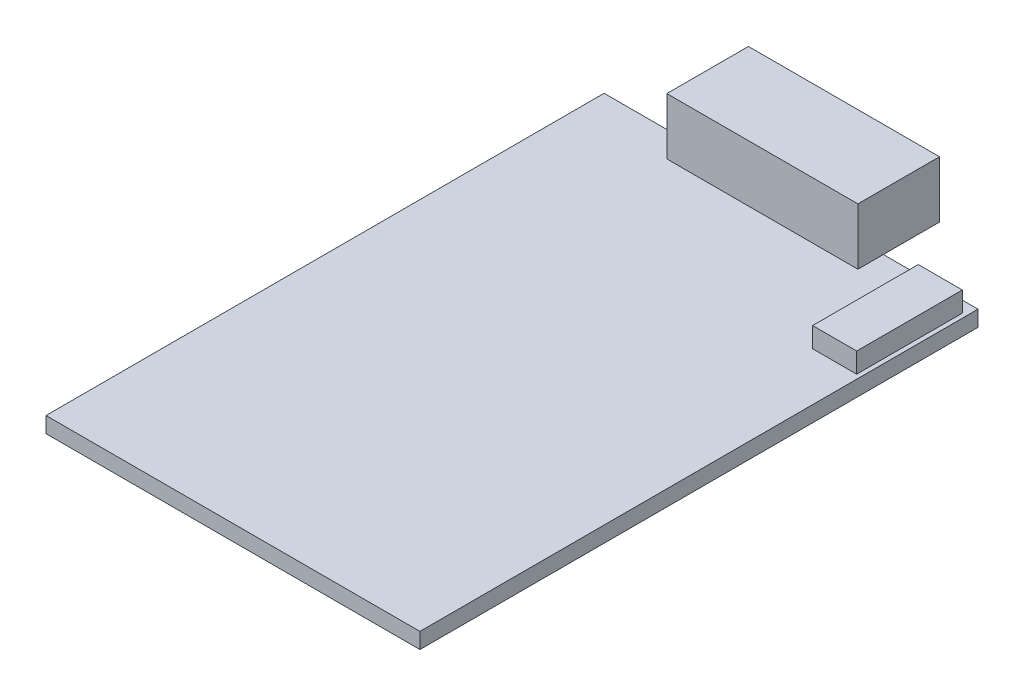
ISO-10303-21;
HEADER;
FILE_DESCRIPTION(('STEP AP214'),'2;1');
FILE_NAME('part.step','',(''),(''),'','','');
FILE_SCHEMA(('AUTOMOTIVE_DESIGN { 1 0 10303 214 1 1 1 1 }'));
ENDSEC;
DATA;
#1=APPLICATION_CONTEXT('core data for automotive mechanical design processes');
#2=APPLICATION_PROTOCOL_DEFINITION('international standard','automotive_design',2000,#1);
#3=PRODUCT_CONTEXT('',#1,'mechanical');
#4=PRODUCT('Part','Part','',(#3));
#5=PRODUCT_RELATED_PRODUCT_CATEGORY('part','',(#4));
#6=PRODUCT_DEFINITION_FORMATION('','',#4);
#7=PRODUCT_DEFINITION_CONTEXT('part definition',#1,'design');
#8=PRODUCT_DEFINITION('design','',#6,#7);
#9=PRODUCT_DEFINITION_SHAPE('','',#8);
#10=(LENGTH_UNIT() NAMED_UNIT(*) SI_UNIT(.MILLI.,.METRE.));
#11=(NAMED_UNIT(*) PLANE_ANGLE_UNIT() SI_UNIT($,.RADIAN.));
#12=(NAMED_UNIT(*) SI_UNIT($,.STERADIAN.) SOLID_ANGLE_UNIT());
#13=UNCERTAINTY_MEASURE_WITH_UNIT(LENGTH_MEASURE(1.E-05),#10,'distance_accuracy_value','');
#14=(GEOMETRIC_REPRESENTATION_CONTEXT(3) GLOBAL_UNCERTAINTY_ASSIGNED_CONTEXT((#13)) GLOBAL_UNIT_ASSIGNED_CONTEXT((#10,
#11,#12)) REPRESENTATION_CONTEXT('',''));
#15=CARTESIAN_POINT('',(0.,0.,0.));
#16=DIRECTION('',(0.,0.,1.));
#17=DIRECTION('',(1.,0.,0.));
#18=AXIS2_PLACEMENT_3D('',#15,#16,#17);
#19=CARTESIAN_POINT('',(0.,1.67,0.));
#20=DIRECTION('',(0.,-1.,0.));
#21=DIRECTION('',(0.,0.,-1.));
#22=AXIS2_PLACEMENT_3D('',#19,#20,#21);
#23=PLANE('',#22);
#24=DIRECTION('',(0.,0.,-1.));
#25=VECTOR('',#24,1.);
#26=CARTESIAN_POINT('',(29.6,1.67,0.));
#27=LINE('',#26,#25);
#28=CARTESIAN_POINT('',(29.6,1.67,-56.45));
#29=VERTEX_POINT('',#28);
#30=CARTESIAN_POINT('',(29.6,1.67,-59.15));
#31=VERTEX_POINT('',#30);
#32=EDGE_CURVE('E166',#29,#31,#27,.T.);
#33=ORIENTED_EDGE('',*,*,#32,.F.);
#34=DIRECTION('',(1.,0.,0.));
#35=VECTOR('',#34,1.);
#36=CARTESIAN_POINT('',(0.,1.67,-56.45));
#37=LINE('',#36,#35);
#38=CARTESIAN_POINT('',(9.34999999999998,1.67,-56.45));
#39=VERTEX_POINT('',#38);
#40=EDGE_CURVE('E176',#39,#29,#37,.T.);
#41=ORIENTED_EDGE('',*,*,#40,.F.);
#42=DIRECTION('',(0.,0.,1.));
#43=VECTOR('',#42,1.);
#44=CARTESIAN_POINT('',(9.35,1.67,0.));
#45=LINE('',#44,#43);
#46=CARTESIAN_POINT('',(9.34999999999998,1.67,-59.15));
#47=VERTEX_POINT('',#46);
#48=EDGE_CURVE('E11',#47,#39,#45,.T.);
#49=ORIENTED_EDGE('',*,*,#48,.F.);
#50=DIRECTION('',(-1.,0.,0.));
#51=VECTOR('',#50,1.);
#52=CARTESIAN_POINT('',(0.,1.67,-59.15));
#53=LINE('',#52,#51);
#54=CARTESIAN_POINT('',(0.,1.67,-59.15));
#55=VERTEX_POINT('',#54);
#56=EDGE_CURVE('E202',#47,#55,#53,.T.);
#57=ORIENTED_EDGE('',*,*,#56,.T.);
#58=DIRECTION('',(0.,0.,1.));
#59=VECTOR('',#58,1.);
#60=CARTESIAN_POINT('',(0.,1.67,0.));
#61=LINE('',#60,#59);
#62=CARTESIAN_POINT('',(0.,1.67,0.));
#63=VERTEX_POINT('',#62);
#64=EDGE_CURVE('E194',#55,#63,#61,.T.);
#65=ORIENTED_EDGE('',*,*,#64,.T.);
#66=DIRECTION('',(1.,0.,0.));
#67=VECTOR('',#66,1.);
#68=CARTESIAN_POINT('',(0.,1.67,0.));
#69=LINE('',#68,#67);
#70=CARTESIAN_POINT('',(39.63,1.67,0.));
#71=VERTEX_POINT('',#70);
#72=EDGE_CURVE('E197',#63,#71,#69,.T.);
#73=ORIENTED_EDGE('',*,*,#72,.T.);
#74=DIRECTION('',(0.,0.,-1.));
#75=VECTOR('',#74,1.);
#76=CARTESIAN_POINT('',(39.63,1.67,0.));
#77=LINE('',#76,#75);
#78=CARTESIAN_POINT('',(39.63,1.67,-59.15));
#79=VERTEX_POINT('',#78);
#80=EDGE_CURVE('E200',#71,#79,#77,.T.);
#81=ORIENTED_EDGE('',*,*,#80,.T.);
#82=EDGE_CURVE('E203',#79,#31,#53,.T.);
#83=ORIENTED_EDGE('',*,*,#82,.T.);
#84=EDGE_LOOP('',(#33,#41,#49,#57,#65,#73,#81,#83));
#85=FACE_BOUND('',#84,.T.);
#86=DIRECTION('',(0.,0.,-1.));
#87=VECTOR('',#86,1.);
#88=CARTESIAN_POINT('',(39.17,1.67,0.));
#89=LINE('',#88,#87);
#90=CARTESIAN_POINT('',(39.17,1.67,-46.75));
#91=VERTEX_POINT('',#90);
#92=CARTESIAN_POINT('',(39.17,1.67,-57.95));
#93=VERTEX_POINT('',#92);
#94=EDGE_CURVE('E149',#91,#93,#89,.T.);
#95=ORIENTED_EDGE('',*,*,#94,.F.);
#96=DIRECTION('',(1.,0.,0.));
#97=VECTOR('',#96,1.);
#98=CARTESIAN_POINT('',(0.,1.67,-46.75));
#99=LINE('',#98,#97);
#100=CARTESIAN_POINT('',(34.5,1.67,-46.75));
#101=VERTEX_POINT('',#100);
#102=EDGE_CURVE('E150',#101,#91,#99,.T.);
#103=ORIENTED_EDGE('',*,*,#102,.F.);
#104=DIRECTION('',(0.,0.,1.));
#105=VECTOR('',#104,1.);
#106=CARTESIAN_POINT('',(34.5,1.67,0.));
#107=LINE('',#106,#105);
#108=CARTESIAN_POINT('',(34.5,1.67,-57.95));
#109=VERTEX_POINT('',#108);
#110=EDGE_CURVE('E55',#109,#101,#107,.T.);
#111=ORIENTED_EDGE('',*,*,#110,.F.);
#112=DIRECTION('',(-1.,0.,0.));
#113=VECTOR('',#112,1.);
#114=CARTESIAN_POINT('',(0.,1.67,-57.95));
#115=LINE('',#114,#113);
#116=EDGE_CURVE('E50',#93,#109,#115,.T.);
#117=ORIENTED_EDGE('',*,*,#116,.F.);
#118=EDGE_LOOP('',(#95,#103,#111,#117));
#119=FACE_BOUND('',#118,.T.);
#120=ADVANCED_FACE('F33',(#85,#119),#23,.F.);
#121=CARTESIAN_POINT('',(0.,1.67,0.));
#122=DIRECTION('',(1.,0.,0.));
#123=DIRECTION('',(0.,0.,-1.));
#124=AXIS2_PLACEMENT_3D('',#121,#122,#123);
#125=PLANE('',#124);
#126=DIRECTION('',(0.,0.,1.));
#127=VECTOR('',#126,1.);
#128=CARTESIAN_POINT('',(0.,0.,0.));
#129=LINE('',#128,#127);
#130=CARTESIAN_POINT('',(0.,0.,-59.15));
#131=VERTEX_POINT('',#130);
#132=CARTESIAN_POINT('',(0.,0.,0.));
#133=VERTEX_POINT('',#132);
#134=EDGE_CURVE('E193',#131,#133,#129,.T.);
#135=ORIENTED_EDGE('',*,*,#134,.T.);
#136=DIRECTION('',(0.,-1.,0.));
#137=VECTOR('',#136,1.);
#138=CARTESIAN_POINT('',(0.,1.67,0.));
#139=LINE('',#138,#137);
#140=EDGE_CURVE('E37',#63,#133,#139,.T.);
#141=ORIENTED_EDGE('',*,*,#140,.F.);
#142=ORIENTED_EDGE('',*,*,#64,.F.);
#143=DIRECTION('',(0.,-1.,0.));
#144=VECTOR('',#143,1.);
#145=CARTESIAN_POINT('',(0.,1.67,-59.15));
#146=LINE('',#145,#144);
#147=EDGE_CURVE('E206',#55,#131,#146,.T.);
#148=ORIENTED_EDGE('',*,*,#147,.T.);
#149=EDGE_LOOP('',(#135,#141,#142,#148));
#150=FACE_BOUND('',#149,.T.);
#151=ADVANCED_FACE('F35',(#150),#125,.F.);
#152=CARTESIAN_POINT('',(0.,1.67,0.));
#153=DIRECTION('',(0.,0.,-1.));
#154=DIRECTION('',(-1.,0.,0.));
#155=AXIS2_PLACEMENT_3D('',#152,#153,#154);
#156=PLANE('',#155);
#157=DIRECTION('',(1.,0.,0.));
#158=VECTOR('',#157,1.);
#159=CARTESIAN_POINT('',(0.,0.,0.));
#160=LINE('',#159,#158);
#161=CARTESIAN_POINT('',(39.63,0.,0.));
#162=VERTEX_POINT('',#161);
#163=EDGE_CURVE('E210',#133,#162,#160,.T.);
#164=ORIENTED_EDGE('',*,*,#163,.T.);
#165=DIRECTION('',(0.,-1.,0.));
#166=VECTOR('',#165,1.);
#167=CARTESIAN_POINT('',(39.63,1.67,0.));
#168=LINE('',#167,#166);
#169=EDGE_CURVE('E219',#71,#162,#168,.T.);
#170=ORIENTED_EDGE('',*,*,#169,.F.);
#171=ORIENTED_EDGE('',*,*,#72,.F.);
#172=ORIENTED_EDGE('',*,*,#140,.T.);
#173=EDGE_LOOP('',(#164,#170,#171,#172));
#174=FACE_BOUND('',#173,.T.);
#175=ADVANCED_FACE('F228',(#174),#156,.F.);
#176=CARTESIAN_POINT('',(39.63,1.67,0.));
#177=DIRECTION('',(-1.,0.,0.));
#178=DIRECTION('',(0.,0.,1.));
#179=AXIS2_PLACEMENT_3D('',#176,#177,#178);
#180=PLANE('',#179);
#181=DIRECTION('',(0.,0.,-1.));
#182=VECTOR('',#181,1.);
#183=CARTESIAN_POINT('',(39.63,0.,0.));
#184=LINE('',#183,#182);
#185=CARTESIAN_POINT('',(39.63,0.,-59.15));
#186=VERTEX_POINT('',#185);
#187=EDGE_CURVE('E212',#162,#186,#184,.T.);
#188=ORIENTED_EDGE('',*,*,#187,.T.);
#189=DIRECTION('',(0.,-1.,0.));
#190=VECTOR('',#189,1.);
#191=CARTESIAN_POINT('',(39.63,1.67,-59.15));
#192=LINE('',#191,#190);
#193=EDGE_CURVE('E217',#79,#186,#192,.T.);
#194=ORIENTED_EDGE('',*,*,#193,.F.);
#195=ORIENTED_EDGE('',*,*,#80,.F.);
#196=ORIENTED_EDGE('',*,*,#169,.T.);
#197=EDGE_LOOP('',(#188,#194,#195,#196));
#198=FACE_BOUND('',#197,.T.);
#199=ADVANCED_FACE('F237',(#198),#180,.F.);
#200=CARTESIAN_POINT('',(0.,1.67,-59.15));
#201=DIRECTION('',(0.,0.,1.));
#202=DIRECTION('',(1.,0.,0.));
#203=AXIS2_PLACEMENT_3D('',#200,#201,#202);
#204=PLANE('',#203);
#205=DIRECTION('',(-1.,0.,0.));
#206=VECTOR('',#205,1.);
#207=CARTESIAN_POINT('',(0.,0.,-59.15));
#208=LINE('',#207,#206);
#209=EDGE_CURVE('E198',#186,#131,#208,.T.);
#210=ORIENTED_EDGE('',*,*,#209,.T.);
#211=ORIENTED_EDGE('',*,*,#147,.F.);
#212=ORIENTED_EDGE('',*,*,#56,.F.);
#213=EDGE_CURVE('E207',#31,#47,#53,.T.);
#214=ORIENTED_EDGE('',*,*,#213,.F.);
#215=ORIENTED_EDGE('',*,*,#82,.F.);
#216=ORIENTED_EDGE('',*,*,#193,.T.);
#217=EDGE_LOOP('',(#210,#211,#212,#214,#215,#216));
#218=FACE_BOUND('',#217,.T.);
#219=ADVANCED_FACE('F240',(#218),#204,.F.);
#220=CARTESIAN_POINT('',(0.,0.,0.));
#221=DIRECTION('',(0.,-1.,0.));
#222=DIRECTION('',(0.,0.,-1.));
#223=AXIS2_PLACEMENT_3D('',#220,#221,#222);
#224=PLANE('',#223);
#225=ORIENTED_EDGE('',*,*,#134,.F.);
#226=ORIENTED_EDGE('',*,*,#209,.F.);
#227=ORIENTED_EDGE('',*,*,#187,.F.);
#228=ORIENTED_EDGE('',*,*,#163,.F.);
#229=EDGE_LOOP('',(#225,#226,#227,#228));
#230=FACE_BOUND('',#229,.T.);
#231=ADVANCED_FACE('F235',(#230),#224,.T.);
#232=CARTESIAN_POINT('',(0.,1.67,0.));
#233=DIRECTION('',(0.,1.,0.));
#234=DIRECTION('',(0.,0.,1.));
#235=AXIS2_PLACEMENT_3D('',#232,#233,#234);
#236=PLANE('',#235);
#237=CARTESIAN_POINT('',(29.6,1.67,-65.1));
#238=VERTEX_POINT('',#237);
#239=EDGE_CURVE('E179',#31,#238,#27,.T.);
#240=ORIENTED_EDGE('',*,*,#239,.F.);
#241=ORIENTED_EDGE('',*,*,#213,.T.);
#242=CARTESIAN_POINT('',(9.34999999999998,1.67,-65.1));
#243=VERTEX_POINT('',#242);
#244=EDGE_CURVE('E43',#243,#47,#45,.T.);
#245=ORIENTED_EDGE('',*,*,#244,.F.);
#246=DIRECTION('',(-1.,0.,0.));
#247=VECTOR('',#246,1.);
#248=CARTESIAN_POINT('',(0.,1.67,-65.1));
#249=LINE('',#248,#247);
#250=EDGE_CURVE('E161',#238,#243,#249,.T.);
#251=ORIENTED_EDGE('',*,*,#250,.F.);
#252=EDGE_LOOP('',(#240,#241,#245,#251));
#253=FACE_BOUND('',#252,.T.);
#254=ADVANCED_FACE('F247',(#253),#236,.F.);
#255=CARTESIAN_POINT('',(0.,7.67,-65.1));
#256=DIRECTION('',(0.,0.,1.));
#257=DIRECTION('',(1.,0.,0.));
#258=AXIS2_PLACEMENT_3D('',#255,#256,#257);
#259=PLANE('',#258);
#260=ORIENTED_EDGE('',*,*,#250,.T.);
#261=DIRECTION('',(0.,-1.,0.));
#262=VECTOR('',#261,1.);
#263=CARTESIAN_POINT('',(9.34999999999998,7.67,-65.1));
#264=LINE('',#263,#262);
#265=CARTESIAN_POINT('',(9.34999999999998,7.67,-65.1));
#266=VERTEX_POINT('',#265);
#267=EDGE_CURVE('E190',#266,#243,#264,.T.);
#268=ORIENTED_EDGE('',*,*,#267,.F.);
#269=DIRECTION('',(-1.,0.,0.));
#270=VECTOR('',#269,1.);
#271=CARTESIAN_POINT('',(0.,7.67,-65.1));
#272=LINE('',#271,#270);
#273=CARTESIAN_POINT('',(29.6,7.67,-65.1));
#274=VERTEX_POINT('',#273);
#275=EDGE_CURVE('E162',#274,#266,#272,.T.);
#276=ORIENTED_EDGE('',*,*,#275,.F.);
#277=DIRECTION('',(0.,-1.,0.));
#278=VECTOR('',#277,1.);
#279=CARTESIAN_POINT('',(29.6,7.67,-65.1));
#280=LINE('',#279,#278);
#281=EDGE_CURVE('E172',#274,#238,#280,.T.);
#282=ORIENTED_EDGE('',*,*,#281,.T.);
#283=EDGE_LOOP('',(#260,#268,#276,#282));
#284=FACE_BOUND('',#283,.T.);
#285=ADVANCED_FACE('F262',(#284),#259,.F.);
#286=CARTESIAN_POINT('',(9.35,7.67,0.));
#287=DIRECTION('',(1.,0.,0.));
#288=DIRECTION('',(0.,0.,-1.));
#289=AXIS2_PLACEMENT_3D('',#286,#287,#288);
#290=PLANE('',#289);
#291=ORIENTED_EDGE('',*,*,#244,.T.);
#292=ORIENTED_EDGE('',*,*,#48,.T.);
#293=DIRECTION('',(0.,-1.,0.));
#294=VECTOR('',#293,1.);
#295=CARTESIAN_POINT('',(9.34999999999998,7.67,-56.45));
#296=LINE('',#295,#294);
#297=CARTESIAN_POINT('',(9.34999999999998,7.67,-56.45));
#298=VERTEX_POINT('',#297);
#299=EDGE_CURVE('E187',#298,#39,#296,.T.);
#300=ORIENTED_EDGE('',*,*,#299,.F.);
#301=DIRECTION('',(0.,0.,1.));
#302=VECTOR('',#301,1.);
#303=CARTESIAN_POINT('',(9.35,7.67,0.));
#304=LINE('',#303,#302);
#305=EDGE_CURVE('E165',#266,#298,#304,.T.);
#306=ORIENTED_EDGE('',*,*,#305,.F.);
#307=ORIENTED_EDGE('',*,*,#267,.T.);
#308=EDGE_LOOP('',(#291,#292,#300,#306,#307));
#309=FACE_BOUND('',#308,.T.);
#310=ADVANCED_FACE('F258',(#309),#290,.F.);
#311=CARTESIAN_POINT('',(0.,7.67,-56.45));
#312=DIRECTION('',(0.,0.,-1.));
#313=DIRECTION('',(-1.,0.,0.));
#314=AXIS2_PLACEMENT_3D('',#311,#312,#313);
#315=PLANE('',#314);
#316=ORIENTED_EDGE('',*,*,#40,.T.);
#317=DIRECTION('',(0.,-1.,0.));
#318=VECTOR('',#317,1.);
#319=CARTESIAN_POINT('',(29.6,7.67,-56.45));
#320=LINE('',#319,#318);
#321=CARTESIAN_POINT('',(29.6,7.67,-56.45));
#322=VERTEX_POINT('',#321);
#323=EDGE_CURVE('E184',#322,#29,#320,.T.);
#324=ORIENTED_EDGE('',*,*,#323,.F.);
#325=DIRECTION('',(1.,0.,0.));
#326=VECTOR('',#325,1.);
#327=CARTESIAN_POINT('',(0.,7.67,-56.45));
#328=LINE('',#327,#326);
#329=EDGE_CURVE('E168',#298,#322,#328,.T.);
#330=ORIENTED_EDGE('',*,*,#329,.F.);
#331=ORIENTED_EDGE('',*,*,#299,.T.);
#332=EDGE_LOOP('',(#316,#324,#330,#331));
#333=FACE_BOUND('',#332,.T.);
#334=ADVANCED_FACE('F255',(#333),#315,.F.);
#335=CARTESIAN_POINT('',(29.6,7.67,0.));
#336=DIRECTION('',(-1.,0.,0.));
#337=DIRECTION('',(0.,0.,1.));
#338=AXIS2_PLACEMENT_3D('',#335,#336,#337);
#339=PLANE('',#338);
#340=ORIENTED_EDGE('',*,*,#32,.T.);
#341=ORIENTED_EDGE('',*,*,#239,.T.);
#342=ORIENTED_EDGE('',*,*,#281,.F.);
#343=DIRECTION('',(0.,0.,-1.));
#344=VECTOR('',#343,1.);
#345=CARTESIAN_POINT('',(29.6,7.67,0.));
#346=LINE('',#345,#344);
#347=EDGE_CURVE('E170',#322,#274,#346,.T.);
#348=ORIENTED_EDGE('',*,*,#347,.F.);
#349=ORIENTED_EDGE('',*,*,#323,.T.);
#350=EDGE_LOOP('',(#340,#341,#342,#348,#349));
#351=FACE_BOUND('',#350,.T.);
#352=ADVANCED_FACE('F250',(#351),#339,.F.);
#353=CARTESIAN_POINT('',(0.,7.67,0.));
#354=DIRECTION('',(0.,1.,0.));
#355=DIRECTION('',(0.,0.,1.));
#356=AXIS2_PLACEMENT_3D('',#353,#354,#355);
#357=PLANE('',#356);
#358=ORIENTED_EDGE('',*,*,#275,.T.);
#359=ORIENTED_EDGE('',*,*,#305,.T.);
#360=ORIENTED_EDGE('',*,*,#329,.T.);
#361=ORIENTED_EDGE('',*,*,#347,.T.);
#362=EDGE_LOOP('',(#358,#359,#360,#361));
#363=FACE_BOUND('',#362,.T.);
#364=ADVANCED_FACE('F264',(#363),#357,.T.);
#365=CARTESIAN_POINT('',(39.17,3.8,-57.95));
#366=DIRECTION('',(-1.,0.,0.));
#367=DIRECTION('',(0.,0.,1.));
#368=AXIS2_PLACEMENT_3D('',#365,#366,#367);
#369=PLANE('',#368);
#370=DIRECTION('',(0.,-1.,0.));
#371=VECTOR('',#370,1.);
#372=CARTESIAN_POINT('',(39.17,3.8,-46.75));
#373=LINE('',#372,#371);
#374=CARTESIAN_POINT('',(39.17,3.8,-46.75));
#375=VERTEX_POINT('',#374);
#376=EDGE_CURVE('E385',#375,#91,#373,.T.);
#377=ORIENTED_EDGE('',*,*,#376,.T.);
#378=ORIENTED_EDGE('',*,*,#94,.T.);
#379=DIRECTION('',(0.,-1.,0.));
#380=VECTOR('',#379,1.);
#381=CARTESIAN_POINT('',(39.17,3.8,-57.95));
#382=LINE('',#381,#380);
#383=CARTESIAN_POINT('',(39.17,3.8,-57.95));
#384=VERTEX_POINT('',#383);
#385=EDGE_CURVE('E132',#384,#93,#382,.T.);
#386=ORIENTED_EDGE('',*,*,#385,.F.);
#387=DIRECTION('',(0.,0.,-1.));
#388=VECTOR('',#387,1.);
#389=CARTESIAN_POINT('',(39.17,3.8,-57.95));
#390=LINE('',#389,#388);
#391=EDGE_CURVE('E138',#375,#384,#390,.T.);
#392=ORIENTED_EDGE('',*,*,#391,.F.);
#393=EDGE_LOOP('',(#377,#378,#386,#392));
#394=FACE_BOUND('',#393,.T.);
#395=ADVANCED_FACE('F148',(#394),#369,.F.);
#396=CARTESIAN_POINT('',(39.17,3.8,-57.95));
#397=DIRECTION('',(0.,0.,1.));
#398=DIRECTION('',(1.,0.,0.));
#399=AXIS2_PLACEMENT_3D('',#396,#397,#398);
#400=PLANE('',#399);
#401=ORIENTED_EDGE('',*,*,#385,.T.);
#402=ORIENTED_EDGE('',*,*,#116,.T.);
#403=DIRECTION('',(0.,-1.,0.));
#404=VECTOR('',#403,1.);
#405=CARTESIAN_POINT('',(34.5,3.8,-57.95));
#406=LINE('',#405,#404);
#407=CARTESIAN_POINT('',(34.5,3.8,-57.95));
#408=VERTEX_POINT('',#407);
#409=EDGE_CURVE('E134',#408,#109,#406,.T.);
#410=ORIENTED_EDGE('',*,*,#409,.F.);
#411=DIRECTION('',(-1.,0.,0.));
#412=VECTOR('',#411,1.);
#413=CARTESIAN_POINT('',(39.17,3.8,-57.95));
#414=LINE('',#413,#412);
#415=EDGE_CURVE('E128',#384,#408,#414,.T.);
#416=ORIENTED_EDGE('',*,*,#415,.F.);
#417=EDGE_LOOP('',(#401,#402,#410,#416));
#418=FACE_BOUND('',#417,.T.);
#419=ADVANCED_FACE('F130',(#418),#400,.F.);
#420=CARTESIAN_POINT('',(34.5,3.8,-57.95));
#421=DIRECTION('',(1.,0.,0.));
#422=DIRECTION('',(0.,0.,-1.));
#423=AXIS2_PLACEMENT_3D('',#420,#421,#422);
#424=PLANE('',#423);
#425=ORIENTED_EDGE('',*,*,#409,.T.);
#426=ORIENTED_EDGE('',*,*,#110,.T.);
#427=DIRECTION('',(0.,-1.,0.));
#428=VECTOR('',#427,1.);
#429=CARTESIAN_POINT('',(34.5,3.8,-46.75));
#430=LINE('',#429,#428);
#431=CARTESIAN_POINT('',(34.5,3.8,-46.75));
#432=VERTEX_POINT('',#431);
#433=EDGE_CURVE('E154',#432,#101,#430,.T.);
#434=ORIENTED_EDGE('',*,*,#433,.F.);
#435=DIRECTION('',(0.,0.,1.));
#436=VECTOR('',#435,1.);
#437=CARTESIAN_POINT('',(34.5,3.8,-57.95));
#438=LINE('',#437,#436);
#439=EDGE_CURVE('E137',#408,#432,#438,.T.);
#440=ORIENTED_EDGE('',*,*,#439,.F.);
#441=EDGE_LOOP('',(#425,#426,#434,#440));
#442=FACE_BOUND('',#441,.T.);
#443=ADVANCED_FACE('F352',(#442),#424,.F.);
#444=CARTESIAN_POINT('',(39.17,3.8,-46.75));
#445=DIRECTION('',(0.,0.,-1.));
#446=DIRECTION('',(-1.,0.,0.));
#447=AXIS2_PLACEMENT_3D('',#444,#445,#446);
#448=PLANE('',#447);
#449=ORIENTED_EDGE('',*,*,#433,.T.);
#450=ORIENTED_EDGE('',*,*,#102,.T.);
#451=ORIENTED_EDGE('',*,*,#376,.F.);
#452=DIRECTION('',(1.,0.,0.));
#453=VECTOR('',#452,1.);
#454=CARTESIAN_POINT('',(39.17,3.8,-46.75));
#455=LINE('',#454,#453);
#456=EDGE_CURVE('E143',#432,#375,#455,.T.);
#457=ORIENTED_EDGE('',*,*,#456,.F.);
#458=EDGE_LOOP('',(#449,#450,#451,#457));
#459=FACE_BOUND('',#458,.T.);
#460=ADVANCED_FACE('F360',(#459),#448,.F.);
#461=CARTESIAN_POINT('',(0.,3.8,0.));
#462=DIRECTION('',(0.,-1.,0.));
#463=DIRECTION('',(0.,0.,-1.));
#464=AXIS2_PLACEMENT_3D('',#461,#462,#463);
#465=PLANE('',#464);
#466=ORIENTED_EDGE('',*,*,#391,.T.);
#467=ORIENTED_EDGE('',*,*,#415,.T.);
#468=ORIENTED_EDGE('',*,*,#439,.T.);
#469=ORIENTED_EDGE('',*,*,#456,.T.);
#470=EDGE_LOOP('',(#466,#467,#468,#469));
#471=FACE_BOUND('',#470,.T.);
#472=ADVANCED_FACE('F141',(#471),#465,.F.);
#473=CLOSED_SHELL('',(#120,#151,#175,#199,#219,#231,#254,#285,#310,#334,#352,#364,#395,#419,
#443,#460,#472));
#474=MANIFOLD_SOLID_BREP('B2',#473);
#475=ADVANCED_BREP_SHAPE_REPRESENTATION('',(#18,#474),#14);
#476=SHAPE_DEFINITION_REPRESENTATION(#9,#475);
ENDSEC;
END-ISO-10303-21;
